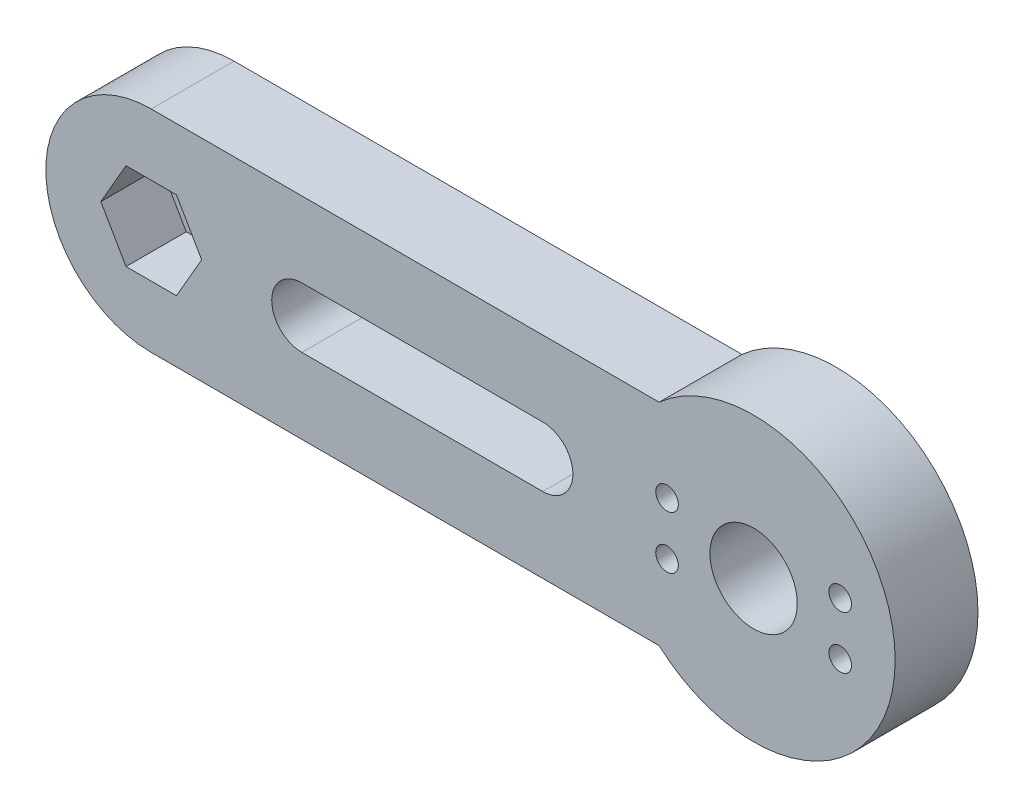
ISO-10303-21;
HEADER;
FILE_DESCRIPTION(('STEP AP214'),'2;1');
FILE_NAME('part.step','',(''),(''),'','','');
FILE_SCHEMA(('AUTOMOTIVE_DESIGN { 1 0 10303 214 1 1 1 1 }'));
ENDSEC;
DATA;
#1=APPLICATION_CONTEXT('core data for automotive mechanical design processes');
#2=APPLICATION_PROTOCOL_DEFINITION('international standard','automotive_design',2000,#1);
#3=PRODUCT_CONTEXT('',#1,'mechanical');
#4=PRODUCT('Part','Part','',(#3));
#5=PRODUCT_RELATED_PRODUCT_CATEGORY('part','',(#4));
#6=PRODUCT_DEFINITION_FORMATION('','',#4);
#7=PRODUCT_DEFINITION_CONTEXT('part definition',#1,'design');
#8=PRODUCT_DEFINITION('design','',#6,#7);
#9=PRODUCT_DEFINITION_SHAPE('','',#8);
#10=(LENGTH_UNIT() NAMED_UNIT(*) SI_UNIT(.MILLI.,.METRE.));
#11=(NAMED_UNIT(*) PLANE_ANGLE_UNIT() SI_UNIT($,.RADIAN.));
#12=(NAMED_UNIT(*) SI_UNIT($,.STERADIAN.) SOLID_ANGLE_UNIT());
#13=UNCERTAINTY_MEASURE_WITH_UNIT(LENGTH_MEASURE(1.E-05),#10,'distance_accuracy_value','');
#14=(GEOMETRIC_REPRESENTATION_CONTEXT(3) GLOBAL_UNCERTAINTY_ASSIGNED_CONTEXT((#13)) GLOBAL_UNIT_ASSIGNED_CONTEXT((#10,
#11,#12)) REPRESENTATION_CONTEXT('',''));
#15=CARTESIAN_POINT('',(0.,0.,0.));
#16=DIRECTION('',(0.,0.,1.));
#17=DIRECTION('',(1.,0.,0.));
#18=AXIS2_PLACEMENT_3D('',#15,#16,#17);
#19=CARTESIAN_POINT('',(0.,0.,-0.000999999999999916));
#20=DIRECTION('',(0.,0.,1.));
#21=DIRECTION('',(1.,0.,0.));
#22=AXIS2_PLACEMENT_3D('',#19,#20,#21);
#23=CYLINDRICAL_SURFACE('',#22,1.6);
#24=CARTESIAN_POINT('',(0.,0.,1.5));
#25=DIRECTION('',(0.,0.,1.));
#26=DIRECTION('',(1.,0.,0.));
#27=AXIS2_PLACEMENT_3D('',#24,#25,#26);
#28=CIRCLE('',#27,1.6);
#29=CARTESIAN_POINT('',(1.6,0.,1.5));
#30=VERTEX_POINT('',#29);
#31=EDGE_CURVE('E19',#30,#30,#28,.F.);
#32=ORIENTED_EDGE('',*,*,#31,.F.);
#33=EDGE_LOOP('',(#32));
#34=FACE_BOUND('',#33,.T.);
#35=CARTESIAN_POINT('',(0.,0.,0.));
#36=DIRECTION('',(0.,0.,1.));
#37=DIRECTION('',(1.,0.,0.));
#38=AXIS2_PLACEMENT_3D('',#35,#36,#37);
#39=CIRCLE('',#38,1.6);
#40=CARTESIAN_POINT('',(1.6,0.,0.));
#41=VERTEX_POINT('',#40);
#42=EDGE_CURVE('E260',#41,#41,#39,.T.);
#43=ORIENTED_EDGE('',*,*,#42,.F.);
#44=EDGE_LOOP('',(#43));
#45=FACE_BOUND('',#44,.T.);
#46=ADVANCED_FACE('F16',(#34,#45),#23,.F.);
#47=CARTESIAN_POINT('',(36.25,-1.75,2.5));
#48=DIRECTION('',(1.,0.,0.));
#49=DIRECTION('',(0.,0.,-1.));
#50=AXIS2_PLACEMENT_3D('',#47,#48,#49);
#51=PLANE('',#50);
#52=DIRECTION('',(0.,0.,-1.));
#53=VECTOR('',#52,1.);
#54=CARTESIAN_POINT('',(36.25,-1.75,2.5));
#55=LINE('',#54,#53);
#56=CARTESIAN_POINT('',(36.25,-1.75,0.));
#57=VERTEX_POINT('',#56);
#58=CARTESIAN_POINT('',(36.25,-1.75,2.5));
#59=VERTEX_POINT('',#58);
#60=EDGE_CURVE('E185',#57,#59,#55,.F.);
#61=ORIENTED_EDGE('',*,*,#60,.T.);
#62=DIRECTION('',(0.,1.,0.));
#63=VECTOR('',#62,1.);
#64=CARTESIAN_POINT('',(36.25,-1.75,2.5));
#65=LINE('',#64,#63);
#66=CARTESIAN_POINT('',(36.25,1.75,2.5));
#67=VERTEX_POINT('',#66);
#68=EDGE_CURVE('E259',#59,#67,#65,.T.);
#69=ORIENTED_EDGE('',*,*,#68,.T.);
#70=DIRECTION('',(0.,0.,-1.));
#71=VECTOR('',#70,1.);
#72=CARTESIAN_POINT('',(36.25,1.75,2.5));
#73=LINE('',#72,#71);
#74=CARTESIAN_POINT('',(36.25,1.75,0.));
#75=VERTEX_POINT('',#74);
#76=EDGE_CURVE('E192',#67,#75,#73,.T.);
#77=ORIENTED_EDGE('',*,*,#76,.T.);
#78=DIRECTION('',(0.,1.,0.));
#79=VECTOR('',#78,1.);
#80=CARTESIAN_POINT('',(36.25,0.,0.));
#81=LINE('',#80,#79);
#82=EDGE_CURVE('E266',#57,#75,#81,.T.);
#83=ORIENTED_EDGE('',*,*,#82,.F.);
#84=EDGE_LOOP('',(#61,#69,#77,#83));
#85=FACE_BOUND('',#84,.T.);
#86=ADVANCED_FACE('F518',(#85),#51,.F.);
#87=CARTESIAN_POINT('',(34.25,1.75,2.5));
#88=DIRECTION('',(0.,0.,-1.));
#89=DIRECTION('',(-1.,0.,0.));
#90=AXIS2_PLACEMENT_3D('',#87,#88,#89);
#91=CYLINDRICAL_SURFACE('',#90,2.);
#92=ORIENTED_EDGE('',*,*,#76,.F.);
#93=CARTESIAN_POINT('',(34.25,1.75,2.5));
#94=DIRECTION('',(0.,0.,-1.));
#95=DIRECTION('',(-1.,0.,0.));
#96=AXIS2_PLACEMENT_3D('',#93,#94,#95);
#97=CIRCLE('',#96,2.);
#98=CARTESIAN_POINT('',(32.25,1.75,2.5));
#99=VERTEX_POINT('',#98);
#100=EDGE_CURVE('E256',#67,#99,#97,.F.);
#101=ORIENTED_EDGE('',*,*,#100,.T.);
#102=DIRECTION('',(0.,0.,1.));
#103=VECTOR('',#102,1.);
#104=CARTESIAN_POINT('',(32.25,1.75,2.5));
#105=LINE('',#104,#103);
#106=CARTESIAN_POINT('',(32.25,1.75,0.));
#107=VERTEX_POINT('',#106);
#108=EDGE_CURVE('E188',#99,#107,#105,.F.);
#109=ORIENTED_EDGE('',*,*,#108,.T.);
#110=CARTESIAN_POINT('',(34.25,1.75,0.));
#111=DIRECTION('',(0.,0.,-1.));
#112=DIRECTION('',(-1.,0.,0.));
#113=AXIS2_PLACEMENT_3D('',#110,#111,#112);
#114=CIRCLE('',#113,2.);
#115=EDGE_CURVE('E264',#75,#107,#114,.F.);
#116=ORIENTED_EDGE('',*,*,#115,.F.);
#117=EDGE_LOOP('',(#92,#101,#109,#116));
#118=FACE_BOUND('',#117,.T.);
#119=ADVANCED_FACE('F515',(#118),#91,.F.);
#120=CARTESIAN_POINT('',(32.25,-1.75,2.5));
#121=DIRECTION('',(-1.,0.,0.));
#122=DIRECTION('',(0.,0.,1.));
#123=AXIS2_PLACEMENT_3D('',#120,#121,#122);
#124=PLANE('',#123);
#125=ORIENTED_EDGE('',*,*,#108,.F.);
#126=DIRECTION('',(0.,1.,0.));
#127=VECTOR('',#126,1.);
#128=CARTESIAN_POINT('',(32.25,-1.75,2.5));
#129=LINE('',#128,#127);
#130=CARTESIAN_POINT('',(32.25,-1.75,2.5));
#131=VERTEX_POINT('',#130);
#132=EDGE_CURVE('E255',#99,#131,#129,.F.);
#133=ORIENTED_EDGE('',*,*,#132,.T.);
#134=DIRECTION('',(0.,0.,-1.));
#135=VECTOR('',#134,1.);
#136=CARTESIAN_POINT('',(32.25,-1.75,2.5));
#137=LINE('',#136,#135);
#138=CARTESIAN_POINT('',(32.25,-1.75,0.));
#139=VERTEX_POINT('',#138);
#140=EDGE_CURVE('E184',#131,#139,#137,.T.);
#141=ORIENTED_EDGE('',*,*,#140,.T.);
#142=DIRECTION('',(0.,1.,0.));
#143=VECTOR('',#142,1.);
#144=CARTESIAN_POINT('',(32.25,0.,0.));
#145=LINE('',#144,#143);
#146=EDGE_CURVE('E263',#107,#139,#145,.F.);
#147=ORIENTED_EDGE('',*,*,#146,.F.);
#148=EDGE_LOOP('',(#125,#133,#141,#147));
#149=FACE_BOUND('',#148,.T.);
#150=ADVANCED_FACE('F511',(#149),#124,.F.);
#151=CARTESIAN_POINT('',(34.25,-1.75,2.5));
#152=DIRECTION('',(0.,0.,-1.));
#153=DIRECTION('',(-1.,0.,0.));
#154=AXIS2_PLACEMENT_3D('',#151,#152,#153);
#155=CYLINDRICAL_SURFACE('',#154,2.);
#156=ORIENTED_EDGE('',*,*,#140,.F.);
#157=CARTESIAN_POINT('',(34.25,-1.75,2.5));
#158=DIRECTION('',(0.,0.,-1.));
#159=DIRECTION('',(-1.,0.,0.));
#160=AXIS2_PLACEMENT_3D('',#157,#158,#159);
#161=CIRCLE('',#160,2.);
#162=EDGE_CURVE('E252',#131,#59,#161,.F.);
#163=ORIENTED_EDGE('',*,*,#162,.T.);
#164=ORIENTED_EDGE('',*,*,#60,.F.);
#165=CARTESIAN_POINT('',(34.25,-1.75,0.));
#166=DIRECTION('',(0.,0.,-1.));
#167=DIRECTION('',(-1.,0.,0.));
#168=AXIS2_PLACEMENT_3D('',#165,#166,#167);
#169=CIRCLE('',#168,2.);
#170=EDGE_CURVE('E267',#139,#57,#169,.F.);
#171=ORIENTED_EDGE('',*,*,#170,.F.);
#172=EDGE_LOOP('',(#156,#163,#164,#171));
#173=FACE_BOUND('',#172,.T.);
#174=ADVANCED_FACE('F508',(#173),#155,.F.);
#175=CARTESIAN_POINT('',(47.75,-1.75,2.5));
#176=DIRECTION('',(1.,0.,0.));
#177=DIRECTION('',(0.,0.,-1.));
#178=AXIS2_PLACEMENT_3D('',#175,#176,#177);
#179=PLANE('',#178);
#180=DIRECTION('',(0.,0.,-1.));
#181=VECTOR('',#180,1.);
#182=CARTESIAN_POINT('',(47.75,-1.75,2.5));
#183=LINE('',#182,#181);
#184=CARTESIAN_POINT('',(47.75,-1.75,0.));
#185=VERTEX_POINT('',#184);
#186=CARTESIAN_POINT('',(47.75,-1.75,2.5));
#187=VERTEX_POINT('',#186);
#188=EDGE_CURVE('E136',#185,#187,#183,.F.);
#189=ORIENTED_EDGE('',*,*,#188,.T.);
#190=DIRECTION('',(0.,1.,0.));
#191=VECTOR('',#190,1.);
#192=CARTESIAN_POINT('',(47.75,-1.75,2.5));
#193=LINE('',#192,#191);
#194=CARTESIAN_POINT('',(47.75,1.75,2.5));
#195=VERTEX_POINT('',#194);
#196=EDGE_CURVE('E251',#187,#195,#193,.T.);
#197=ORIENTED_EDGE('',*,*,#196,.T.);
#198=DIRECTION('',(0.,0.,-1.));
#199=VECTOR('',#198,1.);
#200=CARTESIAN_POINT('',(47.75,1.75,2.5));
#201=LINE('',#200,#199);
#202=CARTESIAN_POINT('',(47.75,1.75,0.));
#203=VERTEX_POINT('',#202);
#204=EDGE_CURVE('E153',#195,#203,#201,.T.);
#205=ORIENTED_EDGE('',*,*,#204,.T.);
#206=DIRECTION('',(0.,1.,0.));
#207=VECTOR('',#206,1.);
#208=CARTESIAN_POINT('',(47.75,0.,0.));
#209=LINE('',#208,#207);
#210=EDGE_CURVE('E149',#185,#203,#209,.T.);
#211=ORIENTED_EDGE('',*,*,#210,.F.);
#212=EDGE_LOOP('',(#189,#197,#205,#211));
#213=FACE_BOUND('',#212,.T.);
#214=ADVANCED_FACE('F152',(#213),#179,.F.);
#215=CARTESIAN_POINT('',(45.75,1.75,2.5));
#216=DIRECTION('',(0.,0.,-1.));
#217=DIRECTION('',(-1.,0.,0.));
#218=AXIS2_PLACEMENT_3D('',#215,#216,#217);
#219=CYLINDRICAL_SURFACE('',#218,2.);
#220=ORIENTED_EDGE('',*,*,#204,.F.);
#221=CARTESIAN_POINT('',(45.75,1.75,2.5));
#222=DIRECTION('',(0.,0.,-1.));
#223=DIRECTION('',(-1.,0.,0.));
#224=AXIS2_PLACEMENT_3D('',#221,#222,#223);
#225=CIRCLE('',#224,2.);
#226=CARTESIAN_POINT('',(43.75,1.75,2.5));
#227=VERTEX_POINT('',#226);
#228=EDGE_CURVE('E248',#195,#227,#225,.F.);
#229=ORIENTED_EDGE('',*,*,#228,.T.);
#230=DIRECTION('',(0.,0.,1.));
#231=VECTOR('',#230,1.);
#232=CARTESIAN_POINT('',(43.75,1.75,2.5));
#233=LINE('',#232,#231);
#234=CARTESIAN_POINT('',(43.75,1.75,0.));
#235=VERTEX_POINT('',#234);
#236=EDGE_CURVE('E145',#227,#235,#233,.F.);
#237=ORIENTED_EDGE('',*,*,#236,.T.);
#238=CARTESIAN_POINT('',(45.75,1.75,0.));
#239=DIRECTION('',(0.,0.,-1.));
#240=DIRECTION('',(-1.,0.,0.));
#241=AXIS2_PLACEMENT_3D('',#238,#239,#240);
#242=CIRCLE('',#241,2.);
#243=EDGE_CURVE('E155',#203,#235,#242,.F.);
#244=ORIENTED_EDGE('',*,*,#243,.F.);
#245=EDGE_LOOP('',(#220,#229,#237,#244));
#246=FACE_BOUND('',#245,.T.);
#247=ADVANCED_FACE('F502',(#246),#219,.F.);
#248=CARTESIAN_POINT('',(43.75,-1.75,2.5));
#249=DIRECTION('',(-1.,0.,0.));
#250=DIRECTION('',(0.,0.,1.));
#251=AXIS2_PLACEMENT_3D('',#248,#249,#250);
#252=PLANE('',#251);
#253=ORIENTED_EDGE('',*,*,#236,.F.);
#254=DIRECTION('',(0.,1.,0.));
#255=VECTOR('',#254,1.);
#256=CARTESIAN_POINT('',(43.75,-1.75,2.5));
#257=LINE('',#256,#255);
#258=CARTESIAN_POINT('',(43.75,-1.75,2.5));
#259=VERTEX_POINT('',#258);
#260=EDGE_CURVE('E247',#227,#259,#257,.F.);
#261=ORIENTED_EDGE('',*,*,#260,.T.);
#262=DIRECTION('',(0.,0.,-1.));
#263=VECTOR('',#262,1.);
#264=CARTESIAN_POINT('',(43.75,-1.75,2.5));
#265=LINE('',#264,#263);
#266=CARTESIAN_POINT('',(43.75,-1.75,0.));
#267=VERTEX_POINT('',#266);
#268=EDGE_CURVE('E129',#259,#267,#265,.T.);
#269=ORIENTED_EDGE('',*,*,#268,.T.);
#270=DIRECTION('',(0.,1.,0.));
#271=VECTOR('',#270,1.);
#272=CARTESIAN_POINT('',(43.75,0.,0.));
#273=LINE('',#272,#271);
#274=EDGE_CURVE('E151',#235,#267,#273,.F.);
#275=ORIENTED_EDGE('',*,*,#274,.F.);
#276=EDGE_LOOP('',(#253,#261,#269,#275));
#277=FACE_BOUND('',#276,.T.);
#278=ADVANCED_FACE('F499',(#277),#252,.F.);
#279=CARTESIAN_POINT('',(45.75,-1.75,2.5));
#280=DIRECTION('',(0.,0.,-1.));
#281=DIRECTION('',(-1.,0.,0.));
#282=AXIS2_PLACEMENT_3D('',#279,#280,#281);
#283=CYLINDRICAL_SURFACE('',#282,2.);
#284=ORIENTED_EDGE('',*,*,#268,.F.);
#285=CARTESIAN_POINT('',(45.75,-1.75,2.5));
#286=DIRECTION('',(0.,0.,-1.));
#287=DIRECTION('',(-1.,0.,0.));
#288=AXIS2_PLACEMENT_3D('',#285,#286,#287);
#289=CIRCLE('',#288,2.);
#290=EDGE_CURVE('E141',#259,#187,#289,.F.);
#291=ORIENTED_EDGE('',*,*,#290,.T.);
#292=ORIENTED_EDGE('',*,*,#188,.F.);
#293=CARTESIAN_POINT('',(45.75,-1.75,0.));
#294=DIRECTION('',(0.,0.,-1.));
#295=DIRECTION('',(-1.,0.,0.));
#296=AXIS2_PLACEMENT_3D('',#293,#294,#295);
#297=CIRCLE('',#296,2.);
#298=EDGE_CURVE('E139',#267,#185,#297,.F.);
#299=ORIENTED_EDGE('',*,*,#298,.F.);
#300=EDGE_LOOP('',(#284,#291,#292,#299));
#301=FACE_BOUND('',#300,.T.);
#302=ADVANCED_FACE('F138',(#301),#283,.F.);
#303=CARTESIAN_POINT('',(0.,0.,1.5));
#304=DIRECTION('',(0.,0.,1.));
#305=DIRECTION('',(1.,0.,0.));
#306=AXIS2_PLACEMENT_3D('',#303,#304,#305);
#307=PLANE('',#306);
#308=DIRECTION('',(0.5,-0.866025403784439,0.));
#309=VECTOR('',#308,1.);
#310=CARTESIAN_POINT('',(-3.34863156129983,0.,1.5));
#311=LINE('',#310,#309);
#312=CARTESIAN_POINT('',(-3.34863156129983,0.,1.5));
#313=VERTEX_POINT('',#312);
#314=CARTESIAN_POINT('',(-1.67431578064991,-2.9,1.5));
#315=VERTEX_POINT('',#314);
#316=EDGE_CURVE('E302',#313,#315,#311,.T.);
#317=ORIENTED_EDGE('',*,*,#316,.T.);
#318=DIRECTION('',(1.,0.,0.));
#319=VECTOR('',#318,1.);
#320=CARTESIAN_POINT('',(-1.67431578064991,-2.9,1.5));
#321=LINE('',#320,#319);
#322=CARTESIAN_POINT('',(1.67431578064992,-2.9,1.5));
#323=VERTEX_POINT('',#322);
#324=EDGE_CURVE('E308',#315,#323,#321,.T.);
#325=ORIENTED_EDGE('',*,*,#324,.T.);
#326=DIRECTION('',(0.5,0.866025403784439,0.));
#327=VECTOR('',#326,1.);
#328=CARTESIAN_POINT('',(1.67431578064992,-2.9,1.5));
#329=LINE('',#328,#327);
#330=CARTESIAN_POINT('',(3.34863156129983,0.,1.5));
#331=VERTEX_POINT('',#330);
#332=EDGE_CURVE('E314',#323,#331,#329,.T.);
#333=ORIENTED_EDGE('',*,*,#332,.T.);
#334=DIRECTION('',(-0.5,0.866025403784438,0.));
#335=VECTOR('',#334,1.);
#336=CARTESIAN_POINT('',(3.34863156129983,0.,1.5));
#337=LINE('',#336,#335);
#338=CARTESIAN_POINT('',(1.67431578064991,2.9,1.5));
#339=VERTEX_POINT('',#338);
#340=EDGE_CURVE('E320',#331,#339,#337,.T.);
#341=ORIENTED_EDGE('',*,*,#340,.T.);
#342=DIRECTION('',(1.,0.,0.));
#343=VECTOR('',#342,1.);
#344=CARTESIAN_POINT('',(1.67431578064991,2.9,1.5));
#345=LINE('',#344,#343);
#346=CARTESIAN_POINT('',(-1.67431578064991,2.9,1.5));
#347=VERTEX_POINT('',#346);
#348=EDGE_CURVE('E290',#339,#347,#345,.F.);
#349=ORIENTED_EDGE('',*,*,#348,.T.);
#350=DIRECTION('',(-0.5,-0.866025403784439,0.));
#351=VECTOR('',#350,1.);
#352=CARTESIAN_POINT('',(-1.67431578064991,2.9,1.5));
#353=LINE('',#352,#351);
#354=EDGE_CURVE('E296',#347,#313,#353,.T.);
#355=ORIENTED_EDGE('',*,*,#354,.T.);
#356=EDGE_LOOP('',(#317,#325,#333,#341,#349,#355));
#357=FACE_BOUND('',#356,.T.);
#358=ORIENTED_EDGE('',*,*,#31,.T.);
#359=EDGE_LOOP('',(#358));
#360=FACE_BOUND('',#359,.T.);
#361=ADVANCED_FACE('F402',(#357,#360),#307,.T.);
#362=CARTESIAN_POINT('',(0.,0.,0.));
#363=DIRECTION('',(0.,0.,-1.));
#364=DIRECTION('',(-1.,0.,0.));
#365=AXIS2_PLACEMENT_3D('',#362,#363,#364);
#366=PLANE('',#365);
#367=CARTESIAN_POINT('',(40.,0.,0.));
#368=DIRECTION('',(0.,0.,-1.));
#369=DIRECTION('',(-1.,0.,0.));
#370=AXIS2_PLACEMENT_3D('',#367,#368,#369);
#371=CIRCLE('',#370,2.9);
#372=CARTESIAN_POINT('',(37.1,0.,0.));
#373=VERTEX_POINT('',#372);
#374=EDGE_CURVE('E227',#373,#373,#371,.F.);
#375=ORIENTED_EDGE('',*,*,#374,.T.);
#376=EDGE_LOOP('',(#375));
#377=FACE_BOUND('',#376,.T.);
#378=DIRECTION('',(1.,0.,0.));
#379=VECTOR('',#378,1.);
#380=CARTESIAN_POINT('',(0.,-7.,0.));
#381=LINE('',#380,#379);
#382=CARTESIAN_POINT('',(33.7262451434568,-7.,0.));
#383=VERTEX_POINT('',#382);
#384=CARTESIAN_POINT('',(0.,-7.,0.));
#385=VERTEX_POINT('',#384);
#386=EDGE_CURVE('E166',#383,#385,#381,.F.);
#387=ORIENTED_EDGE('',*,*,#386,.T.);
#388=CARTESIAN_POINT('',(0.,0.,0.));
#389=DIRECTION('',(0.,0.,-1.));
#390=DIRECTION('',(-1.,0.,0.));
#391=AXIS2_PLACEMENT_3D('',#388,#389,#390);
#392=CIRCLE('',#391,7.);
#393=CARTESIAN_POINT('',(0.,7.,0.));
#394=VERTEX_POINT('',#393);
#395=EDGE_CURVE('E230',#394,#385,#392,.F.);
#396=ORIENTED_EDGE('',*,*,#395,.F.);
#397=DIRECTION('',(1.,0.,0.));
#398=VECTOR('',#397,1.);
#399=CARTESIAN_POINT('',(0.,7.,0.));
#400=LINE('',#399,#398);
#401=CARTESIAN_POINT('',(33.7262451434568,7.,0.));
#402=VERTEX_POINT('',#401);
#403=EDGE_CURVE('E161',#394,#402,#400,.T.);
#404=ORIENTED_EDGE('',*,*,#403,.T.);
#405=CARTESIAN_POINT('',(40.,0.,0.));
#406=DIRECTION('',(0.,0.,-1.));
#407=DIRECTION('',(-1.,0.,0.));
#408=AXIS2_PLACEMENT_3D('',#405,#406,#407);
#409=CIRCLE('',#408,9.4);
#410=EDGE_CURVE('E164',#383,#402,#409,.F.);
#411=ORIENTED_EDGE('',*,*,#410,.F.);
#412=EDGE_LOOP('',(#387,#396,#404,#411));
#413=FACE_BOUND('',#412,.T.);
#414=ORIENTED_EDGE('',*,*,#42,.T.);
#415=EDGE_LOOP('',(#414));
#416=FACE_BOUND('',#415,.T.);
#417=CARTESIAN_POINT('',(26.,0.,0.));
#418=DIRECTION('',(0.,0.,1.));
#419=DIRECTION('',(1.,0.,0.));
#420=AXIS2_PLACEMENT_3D('',#417,#418,#419);
#421=CIRCLE('',#420,2.);
#422=CARTESIAN_POINT('',(26.,-2.,0.));
#423=VERTEX_POINT('',#422);
#424=CARTESIAN_POINT('',(26.,2.,0.));
#425=VERTEX_POINT('',#424);
#426=EDGE_CURVE('E178',#423,#425,#421,.T.);
#427=ORIENTED_EDGE('',*,*,#426,.T.);
#428=DIRECTION('',(1.,0.,0.));
#429=VECTOR('',#428,1.);
#430=CARTESIAN_POINT('',(10.,2.,0.));
#431=LINE('',#430,#429);
#432=CARTESIAN_POINT('',(10.,2.,0.));
#433=VERTEX_POINT('',#432);
#434=EDGE_CURVE('E175',#425,#433,#431,.F.);
#435=ORIENTED_EDGE('',*,*,#434,.T.);
#436=CARTESIAN_POINT('',(10.,0.,0.));
#437=DIRECTION('',(0.,0.,1.));
#438=DIRECTION('',(1.,0.,0.));
#439=AXIS2_PLACEMENT_3D('',#436,#437,#438);
#440=CIRCLE('',#439,2.);
#441=CARTESIAN_POINT('',(10.,-2.,0.));
#442=VERTEX_POINT('',#441);
#443=EDGE_CURVE('E241',#433,#442,#440,.T.);
#444=ORIENTED_EDGE('',*,*,#443,.T.);
#445=DIRECTION('',(1.,0.,0.));
#446=VECTOR('',#445,1.);
#447=CARTESIAN_POINT('',(10.,-2.,0.));
#448=LINE('',#447,#446);
#449=EDGE_CURVE('E170',#442,#423,#448,.T.);
#450=ORIENTED_EDGE('',*,*,#449,.T.);
#451=EDGE_LOOP('',(#427,#435,#444,#450));
#452=FACE_BOUND('',#451,.T.);
#453=ORIENTED_EDGE('',*,*,#115,.T.);
#454=ORIENTED_EDGE('',*,*,#146,.T.);
#455=ORIENTED_EDGE('',*,*,#170,.T.);
#456=ORIENTED_EDGE('',*,*,#82,.T.);
#457=EDGE_LOOP('',(#453,#454,#455,#456));
#458=FACE_BOUND('',#457,.T.);
#459=ORIENTED_EDGE('',*,*,#243,.T.);
#460=ORIENTED_EDGE('',*,*,#274,.T.);
#461=ORIENTED_EDGE('',*,*,#298,.T.);
#462=ORIENTED_EDGE('',*,*,#210,.T.);
#463=EDGE_LOOP('',(#459,#460,#461,#462));
#464=FACE_BOUND('',#463,.T.);
#465=ADVANCED_FACE('F148',(#377,#413,#416,#452,#458,#464),#366,.T.);
#466=CARTESIAN_POINT('',(34.25,-1.75,2.5));
#467=DIRECTION('',(0.,0.,1.));
#468=DIRECTION('',(1.,0.,0.));
#469=AXIS2_PLACEMENT_3D('',#466,#467,#468);
#470=PLANE('',#469);
#471=ORIENTED_EDGE('',*,*,#132,.F.);
#472=ORIENTED_EDGE('',*,*,#100,.F.);
#473=ORIENTED_EDGE('',*,*,#68,.F.);
#474=ORIENTED_EDGE('',*,*,#162,.F.);
#475=EDGE_LOOP('',(#471,#472,#473,#474));
#476=FACE_BOUND('',#475,.T.);
#477=CARTESIAN_POINT('',(34.25,-1.75,2.5));
#478=DIRECTION('',(0.,0.,-1.));
#479=DIRECTION('',(-1.,0.,0.));
#480=AXIS2_PLACEMENT_3D('',#477,#478,#479);
#481=CIRCLE('',#480,0.750000000000001);
#482=CARTESIAN_POINT('',(33.5,-1.75,2.5));
#483=VERTEX_POINT('',#482);
#484=EDGE_CURVE('E224',#483,#483,#481,.F.);
#485=ORIENTED_EDGE('',*,*,#484,.T.);
#486=EDGE_LOOP('',(#485));
#487=FACE_BOUND('',#486,.T.);
#488=CARTESIAN_POINT('',(34.25,1.75,2.5));
#489=DIRECTION('',(0.,0.,-1.));
#490=DIRECTION('',(-1.,0.,0.));
#491=AXIS2_PLACEMENT_3D('',#488,#489,#490);
#492=CIRCLE('',#491,0.750000000000001);
#493=CARTESIAN_POINT('',(33.5,1.75,2.5));
#494=VERTEX_POINT('',#493);
#495=EDGE_CURVE('E165',#494,#494,#492,.F.);
#496=ORIENTED_EDGE('',*,*,#495,.T.);
#497=EDGE_LOOP('',(#496));
#498=FACE_BOUND('',#497,.T.);
#499=ADVANCED_FACE('F477',(#476,#487,#498),#470,.F.);
#500=CARTESIAN_POINT('',(45.75,-1.75,2.5));
#501=DIRECTION('',(0.,0.,1.));
#502=DIRECTION('',(1.,0.,0.));
#503=AXIS2_PLACEMENT_3D('',#500,#501,#502);
#504=PLANE('',#503);
#505=ORIENTED_EDGE('',*,*,#260,.F.);
#506=ORIENTED_EDGE('',*,*,#228,.F.);
#507=ORIENTED_EDGE('',*,*,#196,.F.);
#508=ORIENTED_EDGE('',*,*,#290,.F.);
#509=EDGE_LOOP('',(#505,#506,#507,#508));
#510=FACE_BOUND('',#509,.T.);
#511=CARTESIAN_POINT('',(45.75,-1.75,2.5));
#512=DIRECTION('',(0.,0.,-1.));
#513=DIRECTION('',(-1.,0.,0.));
#514=AXIS2_PLACEMENT_3D('',#511,#512,#513);
#515=CIRCLE('',#514,0.750000000000001);
#516=CARTESIAN_POINT('',(45.,-1.75,2.5));
#517=VERTEX_POINT('',#516);
#518=EDGE_CURVE('E221',#517,#517,#515,.F.);
#519=ORIENTED_EDGE('',*,*,#518,.T.);
#520=EDGE_LOOP('',(#519));
#521=FACE_BOUND('',#520,.T.);
#522=CARTESIAN_POINT('',(45.75,1.75,2.5));
#523=DIRECTION('',(0.,0.,-1.));
#524=DIRECTION('',(-1.,0.,0.));
#525=AXIS2_PLACEMENT_3D('',#522,#523,#524);
#526=CIRCLE('',#525,0.750000000000001);
#527=CARTESIAN_POINT('',(45.,1.75,2.5));
#528=VERTEX_POINT('',#527);
#529=EDGE_CURVE('E237',#528,#528,#526,.F.);
#530=ORIENTED_EDGE('',*,*,#529,.T.);
#531=EDGE_LOOP('',(#530));
#532=FACE_BOUND('',#531,.T.);
#533=ADVANCED_FACE('F479',(#510,#521,#532),#504,.F.);
#534=CARTESIAN_POINT('',(26.,0.,-0.00100000000000013));
#535=DIRECTION('',(0.,0.,1.));
#536=DIRECTION('',(1.,0.,0.));
#537=AXIS2_PLACEMENT_3D('',#534,#535,#536);
#538=CYLINDRICAL_SURFACE('',#537,2.);
#539=ORIENTED_EDGE('',*,*,#426,.F.);
#540=DIRECTION('',(0.,0.,-1.));
#541=VECTOR('',#540,1.);
#542=CARTESIAN_POINT('',(26.,-2.,-0.00100000000000013));
#543=LINE('',#542,#541);
#544=CARTESIAN_POINT('',(26.,-2.,5.5));
#545=VERTEX_POINT('',#544);
#546=EDGE_CURVE('E173',#423,#545,#543,.F.);
#547=ORIENTED_EDGE('',*,*,#546,.T.);
#548=CARTESIAN_POINT('',(26.,0.,5.5));
#549=DIRECTION('',(0.,0.,1.));
#550=DIRECTION('',(1.,0.,0.));
#551=AXIS2_PLACEMENT_3D('',#548,#549,#550);
#552=CIRCLE('',#551,2.);
#553=CARTESIAN_POINT('',(26.,2.,5.5));
#554=VERTEX_POINT('',#553);
#555=EDGE_CURVE('E219',#545,#554,#552,.T.);
#556=ORIENTED_EDGE('',*,*,#555,.T.);
#557=DIRECTION('',(0.,0.,1.));
#558=VECTOR('',#557,1.);
#559=CARTESIAN_POINT('',(26.,2.,-0.00100000000000013));
#560=LINE('',#559,#558);
#561=EDGE_CURVE('E177',#554,#425,#560,.F.);
#562=ORIENTED_EDGE('',*,*,#561,.T.);
#563=EDGE_LOOP('',(#539,#547,#556,#562));
#564=FACE_BOUND('',#563,.T.);
#565=ADVANCED_FACE('F486',(#564),#538,.F.);
#566=CARTESIAN_POINT('',(10.,2.,-0.00100000000000013));
#567=DIRECTION('',(0.,1.,0.));
#568=DIRECTION('',(0.,0.,1.));
#569=AXIS2_PLACEMENT_3D('',#566,#567,#568);
#570=PLANE('',#569);
#571=DIRECTION('',(-1.,0.,0.));
#572=VECTOR('',#571,1.);
#573=CARTESIAN_POINT('',(0.,2.,5.5));
#574=LINE('',#573,#572);
#575=CARTESIAN_POINT('',(10.,2.,5.5));
#576=VERTEX_POINT('',#575);
#577=EDGE_CURVE('E218',#554,#576,#574,.T.);
#578=ORIENTED_EDGE('',*,*,#577,.T.);
#579=DIRECTION('',(0.,0.,1.));
#580=VECTOR('',#579,1.);
#581=CARTESIAN_POINT('',(10.,2.,-0.00100000000000013));
#582=LINE('',#581,#580);
#583=EDGE_CURVE('E174',#576,#433,#582,.F.);
#584=ORIENTED_EDGE('',*,*,#583,.T.);
#585=ORIENTED_EDGE('',*,*,#434,.F.);
#586=ORIENTED_EDGE('',*,*,#561,.F.);
#587=EDGE_LOOP('',(#578,#584,#585,#586));
#588=FACE_BOUND('',#587,.T.);
#589=ADVANCED_FACE('F543',(#588),#570,.F.);
#590=CARTESIAN_POINT('',(10.,0.,-0.00100000000000013));
#591=DIRECTION('',(0.,0.,1.));
#592=DIRECTION('',(1.,0.,0.));
#593=AXIS2_PLACEMENT_3D('',#590,#591,#592);
#594=CYLINDRICAL_SURFACE('',#593,2.);
#595=CARTESIAN_POINT('',(10.,0.,5.5));
#596=DIRECTION('',(0.,0.,1.));
#597=DIRECTION('',(1.,0.,0.));
#598=AXIS2_PLACEMENT_3D('',#595,#596,#597);
#599=CIRCLE('',#598,2.);
#600=CARTESIAN_POINT('',(10.,-2.,5.5));
#601=VERTEX_POINT('',#600);
#602=EDGE_CURVE('E214',#576,#601,#599,.T.);
#603=ORIENTED_EDGE('',*,*,#602,.T.);
#604=DIRECTION('',(0.,0.,-1.));
#605=VECTOR('',#604,1.);
#606=CARTESIAN_POINT('',(10.,-2.,-0.00100000000000013));
#607=LINE('',#606,#605);
#608=EDGE_CURVE('E287',#601,#442,#607,.T.);
#609=ORIENTED_EDGE('',*,*,#608,.T.);
#610=ORIENTED_EDGE('',*,*,#443,.F.);
#611=ORIENTED_EDGE('',*,*,#583,.F.);
#612=EDGE_LOOP('',(#603,#609,#610,#611));
#613=FACE_BOUND('',#612,.T.);
#614=ADVANCED_FACE('F547',(#613),#594,.F.);
#615=CARTESIAN_POINT('',(10.,-2.,-0.00100000000000013));
#616=DIRECTION('',(0.,-1.,0.));
#617=DIRECTION('',(0.,0.,-1.));
#618=AXIS2_PLACEMENT_3D('',#615,#616,#617);
#619=PLANE('',#618);
#620=DIRECTION('',(-1.,0.,0.));
#621=VECTOR('',#620,1.);
#622=CARTESIAN_POINT('',(0.,-2.,5.5));
#623=LINE('',#622,#621);
#624=EDGE_CURVE('E217',#601,#545,#623,.F.);
#625=ORIENTED_EDGE('',*,*,#624,.T.);
#626=ORIENTED_EDGE('',*,*,#546,.F.);
#627=ORIENTED_EDGE('',*,*,#449,.F.);
#628=ORIENTED_EDGE('',*,*,#608,.F.);
#629=EDGE_LOOP('',(#625,#626,#627,#628));
#630=FACE_BOUND('',#629,.T.);
#631=ADVANCED_FACE('F549',(#630),#619,.F.);
#632=CARTESIAN_POINT('',(1.67431578064991,2.9,1.5));
#633=DIRECTION('',(0.,1.,0.));
#634=DIRECTION('',(0.,0.,1.));
#635=AXIS2_PLACEMENT_3D('',#632,#633,#634);
#636=PLANE('',#635);
#637=DIRECTION('',(0.,0.,1.));
#638=VECTOR('',#637,1.);
#639=CARTESIAN_POINT('',(-1.67431578064991,2.9,1.5));
#640=LINE('',#639,#638);
#641=CARTESIAN_POINT('',(-1.67431578064991,2.9,5.5));
#642=VERTEX_POINT('',#641);
#643=EDGE_CURVE('E293',#642,#347,#640,.F.);
#644=ORIENTED_EDGE('',*,*,#643,.T.);
#645=ORIENTED_EDGE('',*,*,#348,.F.);
#646=DIRECTION('',(0.,0.,1.));
#647=VECTOR('',#646,1.);
#648=CARTESIAN_POINT('',(1.67431578064991,2.9,1.5));
#649=LINE('',#648,#647);
#650=CARTESIAN_POINT('',(1.67431578064991,2.9,5.5));
#651=VERTEX_POINT('',#650);
#652=EDGE_CURVE('E240',#339,#651,#649,.T.);
#653=ORIENTED_EDGE('',*,*,#652,.T.);
#654=DIRECTION('',(-1.,0.,0.));
#655=VECTOR('',#654,1.);
#656=CARTESIAN_POINT('',(0.,2.9,5.5));
#657=LINE('',#656,#655);
#658=EDGE_CURVE('E335',#651,#642,#657,.T.);
#659=ORIENTED_EDGE('',*,*,#658,.T.);
#660=EDGE_LOOP('',(#644,#645,#653,#659));
#661=FACE_BOUND('',#660,.T.);
#662=ADVANCED_FACE('F410',(#661),#636,.F.);
#663=CARTESIAN_POINT('',(-1.67431578064991,2.9,1.5));
#664=DIRECTION('',(-0.866025403784439,0.5,0.));
#665=DIRECTION('',(-0.5,-0.866025403784439,0.));
#666=AXIS2_PLACEMENT_3D('',#663,#664,#665);
#667=PLANE('',#666);
#668=DIRECTION('',(0.,0.,1.));
#669=VECTOR('',#668,1.);
#670=CARTESIAN_POINT('',(-3.34863156129983,0.,1.5));
#671=LINE('',#670,#669);
#672=CARTESIAN_POINT('',(-3.34863156129983,0.,5.5));
#673=VERTEX_POINT('',#672);
#674=EDGE_CURVE('E299',#673,#313,#671,.F.);
#675=ORIENTED_EDGE('',*,*,#674,.T.);
#676=ORIENTED_EDGE('',*,*,#354,.F.);
#677=ORIENTED_EDGE('',*,*,#643,.F.);
#678=DIRECTION('',(-0.5,-0.866025403784438,0.));
#679=VECTOR('',#678,1.);
#680=CARTESIAN_POINT('',(-1.67431578064991,2.9,5.5));
#681=LINE('',#680,#679);
#682=EDGE_CURVE('E338',#642,#673,#681,.T.);
#683=ORIENTED_EDGE('',*,*,#682,.T.);
#684=EDGE_LOOP('',(#675,#676,#677,#683));
#685=FACE_BOUND('',#684,.T.);
#686=ADVANCED_FACE('F408',(#685),#667,.F.);
#687=CARTESIAN_POINT('',(-3.34863156129983,0.,1.5));
#688=DIRECTION('',(-0.866025403784439,-0.5,0.));
#689=DIRECTION('',(0.5,-0.866025403784439,0.));
#690=AXIS2_PLACEMENT_3D('',#687,#688,#689);
#691=PLANE('',#690);
#692=DIRECTION('',(0.,0.,-1.));
#693=VECTOR('',#692,1.);
#694=CARTESIAN_POINT('',(-1.67431578064991,-2.9,1.5));
#695=LINE('',#694,#693);
#696=CARTESIAN_POINT('',(-1.67431578064991,-2.9,5.5));
#697=VERTEX_POINT('',#696);
#698=EDGE_CURVE('E305',#697,#315,#695,.T.);
#699=ORIENTED_EDGE('',*,*,#698,.T.);
#700=ORIENTED_EDGE('',*,*,#316,.F.);
#701=ORIENTED_EDGE('',*,*,#674,.F.);
#702=DIRECTION('',(0.5,-0.866025403784439,0.));
#703=VECTOR('',#702,1.);
#704=CARTESIAN_POINT('',(-3.34863156129983,0.,5.5));
#705=LINE('',#704,#703);
#706=EDGE_CURVE('E341',#673,#697,#705,.T.);
#707=ORIENTED_EDGE('',*,*,#706,.T.);
#708=EDGE_LOOP('',(#699,#700,#701,#707));
#709=FACE_BOUND('',#708,.T.);
#710=ADVANCED_FACE('F417',(#709),#691,.F.);
#711=CARTESIAN_POINT('',(-1.67431578064991,-2.9,1.5));
#712=DIRECTION('',(0.,-1.,0.));
#713=DIRECTION('',(0.,0.,-1.));
#714=AXIS2_PLACEMENT_3D('',#711,#712,#713);
#715=PLANE('',#714);
#716=DIRECTION('',(0.,0.,1.));
#717=VECTOR('',#716,1.);
#718=CARTESIAN_POINT('',(1.67431578064992,-2.9,1.5));
#719=LINE('',#718,#717);
#720=CARTESIAN_POINT('',(1.67431578064992,-2.9,5.5));
#721=VERTEX_POINT('',#720);
#722=EDGE_CURVE('E311',#721,#323,#719,.F.);
#723=ORIENTED_EDGE('',*,*,#722,.T.);
#724=ORIENTED_EDGE('',*,*,#324,.F.);
#725=ORIENTED_EDGE('',*,*,#698,.F.);
#726=DIRECTION('',(-1.,0.,0.));
#727=VECTOR('',#726,1.);
#728=CARTESIAN_POINT('',(0.,-2.9,5.5));
#729=LINE('',#728,#727);
#730=EDGE_CURVE('E344',#697,#721,#729,.F.);
#731=ORIENTED_EDGE('',*,*,#730,.T.);
#732=EDGE_LOOP('',(#723,#724,#725,#731));
#733=FACE_BOUND('',#732,.T.);
#734=ADVANCED_FACE('F421',(#733),#715,.F.);
#735=CARTESIAN_POINT('',(1.67431578064992,-2.9,1.5));
#736=DIRECTION('',(0.866025403784439,-0.5,0.));
#737=DIRECTION('',(0.5,0.866025403784439,0.));
#738=AXIS2_PLACEMENT_3D('',#735,#736,#737);
#739=PLANE('',#738);
#740=DIRECTION('',(0.,0.,1.));
#741=VECTOR('',#740,1.);
#742=CARTESIAN_POINT('',(3.34863156129983,0.,1.5));
#743=LINE('',#742,#741);
#744=CARTESIAN_POINT('',(3.34863156129983,0.,5.5));
#745=VERTEX_POINT('',#744);
#746=EDGE_CURVE('E317',#745,#331,#743,.F.);
#747=ORIENTED_EDGE('',*,*,#746,.T.);
#748=ORIENTED_EDGE('',*,*,#332,.F.);
#749=ORIENTED_EDGE('',*,*,#722,.F.);
#750=DIRECTION('',(0.5,0.866025403784439,0.));
#751=VECTOR('',#750,1.);
#752=CARTESIAN_POINT('',(1.67431578064992,-2.9,5.5));
#753=LINE('',#752,#751);
#754=EDGE_CURVE('E347',#721,#745,#753,.T.);
#755=ORIENTED_EDGE('',*,*,#754,.T.);
#756=EDGE_LOOP('',(#747,#748,#749,#755));
#757=FACE_BOUND('',#756,.T.);
#758=ADVANCED_FACE('F423',(#757),#739,.F.);
#759=CARTESIAN_POINT('',(3.34863156129983,0.,1.5));
#760=DIRECTION('',(0.866025403784438,0.5,0.));
#761=DIRECTION('',(-0.5,0.866025403784438,0.));
#762=AXIS2_PLACEMENT_3D('',#759,#760,#761);
#763=PLANE('',#762);
#764=ORIENTED_EDGE('',*,*,#652,.F.);
#765=ORIENTED_EDGE('',*,*,#340,.F.);
#766=ORIENTED_EDGE('',*,*,#746,.F.);
#767=DIRECTION('',(-0.5,0.866025403784438,0.));
#768=VECTOR('',#767,1.);
#769=CARTESIAN_POINT('',(3.34863156129983,0.,5.5));
#770=LINE('',#769,#768);
#771=EDGE_CURVE('E213',#745,#651,#770,.T.);
#772=ORIENTED_EDGE('',*,*,#771,.T.);
#773=EDGE_LOOP('',(#764,#765,#766,#772));
#774=FACE_BOUND('',#773,.T.);
#775=ADVANCED_FACE('F424',(#774),#763,.F.);
#776=CARTESIAN_POINT('',(45.75,1.75,5.5));
#777=DIRECTION('',(0.,0.,-1.));
#778=DIRECTION('',(-1.,0.,0.));
#779=AXIS2_PLACEMENT_3D('',#776,#777,#778);
#780=CYLINDRICAL_SURFACE('',#779,0.750000000000001);
#781=ORIENTED_EDGE('',*,*,#529,.F.);
#782=EDGE_LOOP('',(#781));
#783=FACE_BOUND('',#782,.T.);
#784=CARTESIAN_POINT('',(45.75,1.75,5.5));
#785=DIRECTION('',(0.,0.,-1.));
#786=DIRECTION('',(-1.,0.,0.));
#787=AXIS2_PLACEMENT_3D('',#784,#785,#786);
#788=CIRCLE('',#787,0.750000000000001);
#789=CARTESIAN_POINT('',(45.,1.75,5.5));
#790=VERTEX_POINT('',#789);
#791=EDGE_CURVE('E210',#790,#790,#788,.F.);
#792=ORIENTED_EDGE('',*,*,#791,.T.);
#793=EDGE_LOOP('',(#792));
#794=FACE_BOUND('',#793,.T.);
#795=ADVANCED_FACE('F426',(#783,#794),#780,.F.);
#796=CARTESIAN_POINT('',(34.25,1.75,5.5));
#797=DIRECTION('',(0.,0.,-1.));
#798=DIRECTION('',(-1.,0.,0.));
#799=AXIS2_PLACEMENT_3D('',#796,#797,#798);
#800=CYLINDRICAL_SURFACE('',#799,0.750000000000001);
#801=ORIENTED_EDGE('',*,*,#495,.F.);
#802=EDGE_LOOP('',(#801));
#803=FACE_BOUND('',#802,.T.);
#804=CARTESIAN_POINT('',(34.25,1.75,5.5));
#805=DIRECTION('',(0.,0.,-1.));
#806=DIRECTION('',(-1.,0.,0.));
#807=AXIS2_PLACEMENT_3D('',#804,#805,#806);
#808=CIRCLE('',#807,0.750000000000001);
#809=CARTESIAN_POINT('',(33.5,1.75,5.5));
#810=VERTEX_POINT('',#809);
#811=EDGE_CURVE('E207',#810,#810,#808,.F.);
#812=ORIENTED_EDGE('',*,*,#811,.T.);
#813=EDGE_LOOP('',(#812));
#814=FACE_BOUND('',#813,.T.);
#815=ADVANCED_FACE('F433',(#803,#814),#800,.F.);
#816=CARTESIAN_POINT('',(0.,7.,5.5));
#817=DIRECTION('',(0.,-1.,0.));
#818=DIRECTION('',(0.,0.,-1.));
#819=AXIS2_PLACEMENT_3D('',#816,#817,#818);
#820=PLANE('',#819);
#821=DIRECTION('',(0.,0.,-1.));
#822=VECTOR('',#821,1.);
#823=CARTESIAN_POINT('',(0.,7.,5.5));
#824=LINE('',#823,#822);
#825=CARTESIAN_POINT('',(0.,7.,5.5));
#826=VERTEX_POINT('',#825);
#827=EDGE_CURVE('E232',#826,#394,#824,.T.);
#828=ORIENTED_EDGE('',*,*,#827,.F.);
#829=DIRECTION('',(-1.,0.,0.));
#830=VECTOR('',#829,1.);
#831=CARTESIAN_POINT('',(0.,7.,5.5));
#832=LINE('',#831,#830);
#833=CARTESIAN_POINT('',(33.7262451434568,7.,5.5));
#834=VERTEX_POINT('',#833);
#835=EDGE_CURVE('E206',#826,#834,#832,.F.);
#836=ORIENTED_EDGE('',*,*,#835,.T.);
#837=DIRECTION('',(0.,0.,-1.));
#838=VECTOR('',#837,1.);
#839=CARTESIAN_POINT('',(33.7262451434568,7.,5.5));
#840=LINE('',#839,#838);
#841=EDGE_CURVE('E234',#402,#834,#840,.F.);
#842=ORIENTED_EDGE('',*,*,#841,.F.);
#843=ORIENTED_EDGE('',*,*,#403,.F.);
#844=EDGE_LOOP('',(#828,#836,#842,#843));
#845=FACE_BOUND('',#844,.T.);
#846=ADVANCED_FACE('F369',(#845),#820,.F.);
#847=CARTESIAN_POINT('',(40.,0.,5.5));
#848=DIRECTION('',(0.,0.,-1.));
#849=DIRECTION('',(-1.,0.,0.));
#850=AXIS2_PLACEMENT_3D('',#847,#848,#849);
#851=CYLINDRICAL_SURFACE('',#850,9.4);
#852=CARTESIAN_POINT('',(40.,0.,5.5));
#853=DIRECTION('',(0.,0.,-1.));
#854=DIRECTION('',(-1.,0.,0.));
#855=AXIS2_PLACEMENT_3D('',#852,#853,#854);
#856=CIRCLE('',#855,9.4);
#857=CARTESIAN_POINT('',(33.7262451434568,-7.,5.5));
#858=VERTEX_POINT('',#857);
#859=EDGE_CURVE('E203',#834,#858,#856,.T.);
#860=ORIENTED_EDGE('',*,*,#859,.T.);
#861=DIRECTION('',(0.,0.,1.));
#862=VECTOR('',#861,1.);
#863=CARTESIAN_POINT('',(33.7262451434568,-7.,5.5));
#864=LINE('',#863,#862);
#865=EDGE_CURVE('E169',#858,#383,#864,.F.);
#866=ORIENTED_EDGE('',*,*,#865,.T.);
#867=ORIENTED_EDGE('',*,*,#410,.T.);
#868=ORIENTED_EDGE('',*,*,#841,.T.);
#869=EDGE_LOOP('',(#860,#866,#867,#868));
#870=FACE_BOUND('',#869,.T.);
#871=ADVANCED_FACE('F365',(#870),#851,.T.);
#872=CARTESIAN_POINT('',(0.,-7.,5.5));
#873=DIRECTION('',(0.,1.,0.));
#874=DIRECTION('',(0.,0.,1.));
#875=AXIS2_PLACEMENT_3D('',#872,#873,#874);
#876=PLANE('',#875);
#877=ORIENTED_EDGE('',*,*,#865,.F.);
#878=DIRECTION('',(-1.,0.,0.));
#879=VECTOR('',#878,1.);
#880=CARTESIAN_POINT('',(0.,-7.,5.5));
#881=LINE('',#880,#879);
#882=CARTESIAN_POINT('',(0.,-7.,5.5));
#883=VERTEX_POINT('',#882);
#884=EDGE_CURVE('E202',#858,#883,#881,.T.);
#885=ORIENTED_EDGE('',*,*,#884,.T.);
#886=DIRECTION('',(0.,0.,-1.));
#887=VECTOR('',#886,1.);
#888=CARTESIAN_POINT('',(0.,-7.,5.5));
#889=LINE('',#888,#887);
#890=EDGE_CURVE('E34',#385,#883,#889,.F.);
#891=ORIENTED_EDGE('',*,*,#890,.F.);
#892=ORIENTED_EDGE('',*,*,#386,.F.);
#893=EDGE_LOOP('',(#877,#885,#891,#892));
#894=FACE_BOUND('',#893,.T.);
#895=ADVANCED_FACE('F357',(#894),#876,.F.);
#896=CARTESIAN_POINT('',(0.,0.,5.5));
#897=DIRECTION('',(0.,0.,-1.));
#898=DIRECTION('',(-1.,0.,0.));
#899=AXIS2_PLACEMENT_3D('',#896,#897,#898);
#900=CYLINDRICAL_SURFACE('',#899,7.);
#901=ORIENTED_EDGE('',*,*,#827,.T.);
#902=ORIENTED_EDGE('',*,*,#395,.T.);
#903=ORIENTED_EDGE('',*,*,#890,.T.);
#904=CARTESIAN_POINT('',(0.,0.,5.5));
#905=DIRECTION('',(0.,0.,-1.));
#906=DIRECTION('',(-1.,0.,0.));
#907=AXIS2_PLACEMENT_3D('',#904,#905,#906);
#908=CIRCLE('',#907,7.);
#909=EDGE_CURVE('E200',#883,#826,#908,.T.);
#910=ORIENTED_EDGE('',*,*,#909,.T.);
#911=EDGE_LOOP('',(#901,#902,#903,#910));
#912=FACE_BOUND('',#911,.T.);
#913=ADVANCED_FACE('F456',(#912),#900,.T.);
#914=CARTESIAN_POINT('',(40.,0.,5.5));
#915=DIRECTION('',(0.,0.,-1.));
#916=DIRECTION('',(-1.,0.,0.));
#917=AXIS2_PLACEMENT_3D('',#914,#915,#916);
#918=CYLINDRICAL_SURFACE('',#917,2.9);
#919=ORIENTED_EDGE('',*,*,#374,.F.);
#920=EDGE_LOOP('',(#919));
#921=FACE_BOUND('',#920,.T.);
#922=CARTESIAN_POINT('',(40.,0.,5.5));
#923=DIRECTION('',(0.,0.,-1.));
#924=DIRECTION('',(-1.,0.,0.));
#925=AXIS2_PLACEMENT_3D('',#922,#923,#924);
#926=CIRCLE('',#925,2.9);
#927=CARTESIAN_POINT('',(37.1,0.,5.5));
#928=VERTEX_POINT('',#927);
#929=EDGE_CURVE('E197',#928,#928,#926,.F.);
#930=ORIENTED_EDGE('',*,*,#929,.T.);
#931=EDGE_LOOP('',(#930));
#932=FACE_BOUND('',#931,.T.);
#933=ADVANCED_FACE('F452',(#921,#932),#918,.F.);
#934=CARTESIAN_POINT('',(34.25,-1.75,5.5));
#935=DIRECTION('',(0.,0.,-1.));
#936=DIRECTION('',(-1.,0.,0.));
#937=AXIS2_PLACEMENT_3D('',#934,#935,#936);
#938=CYLINDRICAL_SURFACE('',#937,0.750000000000001);
#939=ORIENTED_EDGE('',*,*,#484,.F.);
#940=EDGE_LOOP('',(#939));
#941=FACE_BOUND('',#940,.T.);
#942=CARTESIAN_POINT('',(34.25,-1.75,5.5));
#943=DIRECTION('',(0.,0.,-1.));
#944=DIRECTION('',(-1.,0.,0.));
#945=AXIS2_PLACEMENT_3D('',#942,#943,#944);
#946=CIRCLE('',#945,0.750000000000001);
#947=CARTESIAN_POINT('',(33.5,-1.75,5.5));
#948=VERTEX_POINT('',#947);
#949=EDGE_CURVE('E25',#948,#948,#946,.F.);
#950=ORIENTED_EDGE('',*,*,#949,.T.);
#951=EDGE_LOOP('',(#950));
#952=FACE_BOUND('',#951,.T.);
#953=ADVANCED_FACE('F444',(#941,#952),#938,.F.);
#954=CARTESIAN_POINT('',(45.75,-1.75,5.5));
#955=DIRECTION('',(0.,0.,-1.));
#956=DIRECTION('',(-1.,0.,0.));
#957=AXIS2_PLACEMENT_3D('',#954,#955,#956);
#958=CYLINDRICAL_SURFACE('',#957,0.750000000000001);
#959=ORIENTED_EDGE('',*,*,#518,.F.);
#960=EDGE_LOOP('',(#959));
#961=FACE_BOUND('',#960,.T.);
#962=CARTESIAN_POINT('',(45.75,-1.75,5.5));
#963=DIRECTION('',(0.,0.,-1.));
#964=DIRECTION('',(-1.,0.,0.));
#965=AXIS2_PLACEMENT_3D('',#962,#963,#964);
#966=CIRCLE('',#965,0.750000000000001);
#967=CARTESIAN_POINT('',(45.,-1.75,5.5));
#968=VERTEX_POINT('',#967);
#969=EDGE_CURVE('E11',#968,#968,#966,.F.);
#970=ORIENTED_EDGE('',*,*,#969,.T.);
#971=EDGE_LOOP('',(#970));
#972=FACE_BOUND('',#971,.T.);
#973=ADVANCED_FACE('F438',(#961,#972),#958,.F.);
#974=CARTESIAN_POINT('',(0.,0.,5.5));
#975=DIRECTION('',(0.,0.,-1.));
#976=DIRECTION('',(-1.,0.,0.));
#977=AXIS2_PLACEMENT_3D('',#974,#975,#976);
#978=PLANE('',#977);
#979=ORIENTED_EDGE('',*,*,#969,.F.);
#980=EDGE_LOOP('',(#979));
#981=FACE_BOUND('',#980,.T.);
#982=ORIENTED_EDGE('',*,*,#949,.F.);
#983=EDGE_LOOP('',(#982));
#984=FACE_BOUND('',#983,.T.);
#985=ORIENTED_EDGE('',*,*,#929,.F.);
#986=EDGE_LOOP('',(#985));
#987=FACE_BOUND('',#986,.T.);
#988=ORIENTED_EDGE('',*,*,#909,.F.);
#989=ORIENTED_EDGE('',*,*,#884,.F.);
#990=ORIENTED_EDGE('',*,*,#859,.F.);
#991=ORIENTED_EDGE('',*,*,#835,.F.);
#992=EDGE_LOOP('',(#988,#989,#990,#991));
#993=FACE_BOUND('',#992,.T.);
#994=ORIENTED_EDGE('',*,*,#811,.F.);
#995=EDGE_LOOP('',(#994));
#996=FACE_BOUND('',#995,.T.);
#997=ORIENTED_EDGE('',*,*,#791,.F.);
#998=EDGE_LOOP('',(#997));
#999=FACE_BOUND('',#998,.T.);
#1000=ORIENTED_EDGE('',*,*,#754,.F.);
#1001=ORIENTED_EDGE('',*,*,#730,.F.);
#1002=ORIENTED_EDGE('',*,*,#706,.F.);
#1003=ORIENTED_EDGE('',*,*,#682,.F.);
#1004=ORIENTED_EDGE('',*,*,#658,.F.);
#1005=ORIENTED_EDGE('',*,*,#771,.F.);
#1006=EDGE_LOOP('',(#1000,#1001,#1002,#1003,#1004,#1005));
#1007=FACE_BOUND('',#1006,.T.);
#1008=ORIENTED_EDGE('',*,*,#602,.F.);
#1009=ORIENTED_EDGE('',*,*,#577,.F.);
#1010=ORIENTED_EDGE('',*,*,#555,.F.);
#1011=ORIENTED_EDGE('',*,*,#624,.F.);
#1012=EDGE_LOOP('',(#1008,#1009,#1010,#1011));
#1013=FACE_BOUND('',#1012,.T.);
#1014=ADVANCED_FACE('F361',(#981,#984,#987,#993,#996,#999,#1007,#1013),#978,.F.);
#1015=CLOSED_SHELL('',(#46,#86,#119,#150,#174,#214,#247,#278,#302,#361,#465,#499,#533,#565,#589,
#614,#631,#662,#686,#710,#734,#758,#775,#795,#815,#846,#871,#895,#913,#933,#953,#973,#1014));
#1016=MANIFOLD_SOLID_BREP('B1',#1015);
#1017=ADVANCED_BREP_SHAPE_REPRESENTATION('',(#18,#1016),#14);
#1018=SHAPE_DEFINITION_REPRESENTATION(#9,#1017);
ENDSEC;
END-ISO-10303-21;
